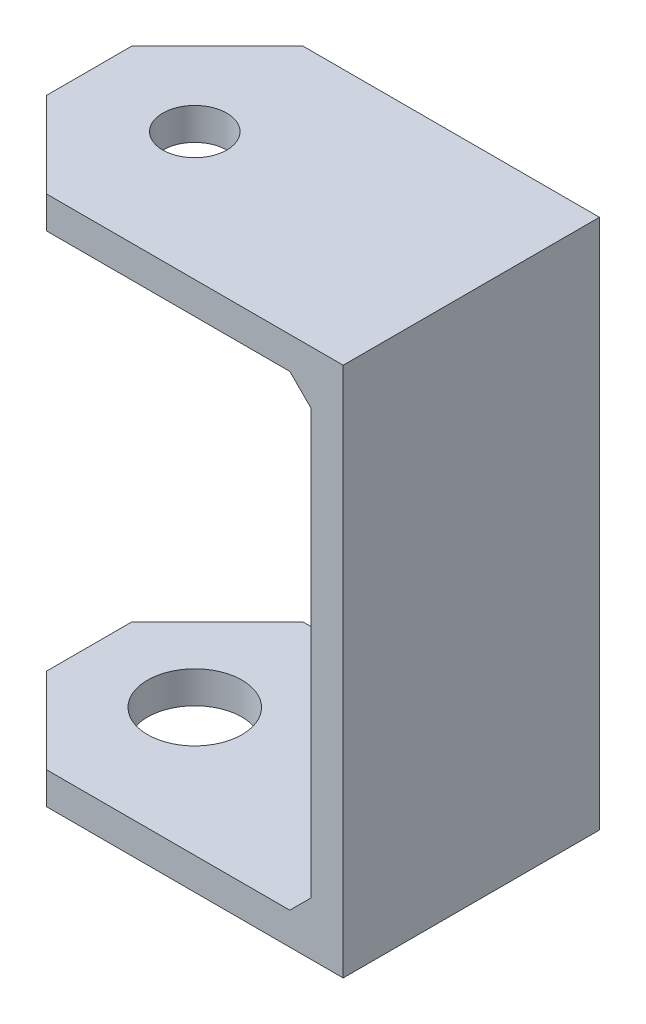
ISO-10303-21;
HEADER;
FILE_DESCRIPTION(('STEP AP214'),'2;1');
FILE_NAME('part.step','',(''),(''),'','','');
FILE_SCHEMA(('AUTOMOTIVE_DESIGN { 1 0 10303 214 1 1 1 1 }'));
ENDSEC;
DATA;
#1=APPLICATION_CONTEXT('core data for automotive mechanical design processes');
#2=APPLICATION_PROTOCOL_DEFINITION('international standard','automotive_design',2000,#1);
#3=PRODUCT_CONTEXT('',#1,'mechanical');
#4=PRODUCT('Part','Part','',(#3));
#5=PRODUCT_RELATED_PRODUCT_CATEGORY('part','',(#4));
#6=PRODUCT_DEFINITION_FORMATION('','',#4);
#7=PRODUCT_DEFINITION_CONTEXT('part definition',#1,'design');
#8=PRODUCT_DEFINITION('design','',#6,#7);
#9=PRODUCT_DEFINITION_SHAPE('','',#8);
#10=(LENGTH_UNIT() NAMED_UNIT(*) SI_UNIT(.MILLI.,.METRE.));
#11=(NAMED_UNIT(*) PLANE_ANGLE_UNIT() SI_UNIT($,.RADIAN.));
#12=(NAMED_UNIT(*) SI_UNIT($,.STERADIAN.) SOLID_ANGLE_UNIT());
#13=UNCERTAINTY_MEASURE_WITH_UNIT(LENGTH_MEASURE(1.E-05),#10,'distance_accuracy_value','');
#14=(GEOMETRIC_REPRESENTATION_CONTEXT(3) GLOBAL_UNCERTAINTY_ASSIGNED_CONTEXT((#13)) GLOBAL_UNIT_ASSIGNED_CONTEXT((#10,
#11,#12)) REPRESENTATION_CONTEXT('',''));
#15=CARTESIAN_POINT('',(0.,0.,0.));
#16=DIRECTION('',(0.,0.,1.));
#17=DIRECTION('',(1.,0.,0.));
#18=AXIS2_PLACEMENT_3D('',#15,#16,#17);
#19=CARTESIAN_POINT('',(0.,0.,-12.));
#20=DIRECTION('',(0.,0.,-1.));
#21=DIRECTION('',(-1.,0.,0.));
#22=AXIS2_PLACEMENT_3D('',#19,#20,#21);
#23=PLANE('',#22);
#24=DIRECTION('',(0.,1.,0.));
#25=VECTOR('',#24,1.);
#26=CARTESIAN_POINT('',(113.025,0.,-12.));
#27=LINE('',#26,#25);
#28=CARTESIAN_POINT('',(113.025,23.2021970213776,-12.));
#29=VERTEX_POINT('',#28);
#30=CARTESIAN_POINT('',(113.025,-26.4978029786224,-12.));
#31=VERTEX_POINT('',#30);
#32=EDGE_CURVE('E683',#29,#31,#27,.F.);
#33=ORIENTED_EDGE('',*,*,#32,.T.);
#34=DIRECTION('',(-1.,0.,0.));
#35=VECTOR('',#34,1.);
#36=CARTESIAN_POINT('',(0.,-26.4978029786224,-12.));
#37=LINE('',#36,#35);
#38=CARTESIAN_POINT('',(85.245,-26.4978029786222,-12.));
#39=VERTEX_POINT('',#38);
#40=EDGE_CURVE('E697',#31,#39,#37,.T.);
#41=ORIENTED_EDGE('',*,*,#40,.T.);
#42=DIRECTION('',(0.,1.,0.));
#43=VECTOR('',#42,1.);
#44=CARTESIAN_POINT('',(85.245,0.,-12.));
#45=LINE('',#44,#43);
#46=CARTESIAN_POINT('',(85.245,-23.4978029786221,-12.));
#47=VERTEX_POINT('',#46);
#48=EDGE_CURVE('E695',#39,#47,#45,.T.);
#49=ORIENTED_EDGE('',*,*,#48,.T.);
#50=DIRECTION('',(-1.,0.,0.));
#51=VECTOR('',#50,1.);
#52=CARTESIAN_POINT('',(0.,-23.4978029786221,-12.));
#53=LINE('',#52,#51);
#54=CARTESIAN_POINT('',(108.025,-23.4978029786223,-12.));
#55=VERTEX_POINT('',#54);
#56=EDGE_CURVE('E693',#47,#55,#53,.F.);
#57=ORIENTED_EDGE('',*,*,#56,.T.);
#58=DIRECTION('',(0.707106781186552,0.707106781186543,0.));
#59=VECTOR('',#58,1.);
#60=CARTESIAN_POINT('',(108.025,-23.4978029786224,-12.));
#61=LINE('',#60,#59);
#62=CARTESIAN_POINT('',(110.025,-21.4978029786224,-12.));
#63=VERTEX_POINT('',#62);
#64=EDGE_CURVE('E664',#55,#63,#61,.T.);
#65=ORIENTED_EDGE('',*,*,#64,.T.);
#66=DIRECTION('',(0.,1.,0.));
#67=VECTOR('',#66,1.);
#68=CARTESIAN_POINT('',(110.025,-23.4978029786224,-12.));
#69=LINE('',#68,#67);
#70=CARTESIAN_POINT('',(110.025,18.2021970213776,-12.));
#71=VERTEX_POINT('',#70);
#72=EDGE_CURVE('E45',#63,#71,#69,.T.);
#73=ORIENTED_EDGE('',*,*,#72,.T.);
#74=DIRECTION('',(0.707106781186545,-0.70710678118655,0.));
#75=VECTOR('',#74,1.);
#76=CARTESIAN_POINT('',(110.025,18.2021970213776,-12.));
#77=LINE('',#76,#75);
#78=CARTESIAN_POINT('',(108.025,20.2021970213776,-12.));
#79=VERTEX_POINT('',#78);
#80=EDGE_CURVE('E650',#79,#71,#77,.T.);
#81=ORIENTED_EDGE('',*,*,#80,.F.);
#82=DIRECTION('',(-1.,0.,0.));
#83=VECTOR('',#82,1.);
#84=CARTESIAN_POINT('',(0.,20.2021970213776,-12.));
#85=LINE('',#84,#83);
#86=CARTESIAN_POINT('',(85.245,20.2021970213778,-12.));
#87=VERTEX_POINT('',#86);
#88=EDGE_CURVE('E690',#79,#87,#85,.T.);
#89=ORIENTED_EDGE('',*,*,#88,.T.);
#90=DIRECTION('',(0.,1.,0.));
#91=VECTOR('',#90,1.);
#92=CARTESIAN_POINT('',(85.245,0.,-12.));
#93=LINE('',#92,#91);
#94=CARTESIAN_POINT('',(85.245,23.2021970213776,-12.));
#95=VERTEX_POINT('',#94);
#96=EDGE_CURVE('E688',#87,#95,#93,.T.);
#97=ORIENTED_EDGE('',*,*,#96,.T.);
#98=DIRECTION('',(-1.,0.,0.));
#99=VECTOR('',#98,1.);
#100=CARTESIAN_POINT('',(0.,23.2021970213776,-12.));
#101=LINE('',#100,#99);
#102=EDGE_CURVE('E685',#95,#29,#101,.F.);
#103=ORIENTED_EDGE('',*,*,#102,.T.);
#104=EDGE_LOOP('',(#33,#41,#49,#57,#65,#73,#81,#89,#97,#103));
#105=FACE_BOUND('',#104,.T.);
#106=ADVANCED_FACE('F35',(#105),#23,.T.);
#107=CARTESIAN_POINT('',(0.,0.,12.));
#108=DIRECTION('',(0.,0.,-1.));
#109=DIRECTION('',(-1.,0.,0.));
#110=AXIS2_PLACEMENT_3D('',#107,#108,#109);
#111=PLANE('',#110);
#112=DIRECTION('',(-0.707106781186545,0.70710678118655,0.));
#113=VECTOR('',#112,1.);
#114=CARTESIAN_POINT('',(110.025,18.2021970213776,12.));
#115=LINE('',#114,#113);
#116=CARTESIAN_POINT('',(110.025,18.2021970213776,12.));
#117=VERTEX_POINT('',#116);
#118=CARTESIAN_POINT('',(108.025,20.2021970213776,12.));
#119=VERTEX_POINT('',#118);
#120=EDGE_CURVE('E679',#117,#119,#115,.T.);
#121=ORIENTED_EDGE('',*,*,#120,.F.);
#122=DIRECTION('',(0.,1.,0.));
#123=VECTOR('',#122,1.);
#124=CARTESIAN_POINT('',(110.025,-23.4978029786224,12.));
#125=LINE('',#124,#123);
#126=CARTESIAN_POINT('',(110.025,-21.4978029786224,12.));
#127=VERTEX_POINT('',#126);
#128=EDGE_CURVE('E54',#117,#127,#125,.F.);
#129=ORIENTED_EDGE('',*,*,#128,.T.);
#130=DIRECTION('',(-0.707106781186552,-0.707106781186543,0.));
#131=VECTOR('',#130,1.);
#132=CARTESIAN_POINT('',(108.025,-23.4978029786224,12.));
#133=LINE('',#132,#131);
#134=CARTESIAN_POINT('',(108.025,-23.4978029786223,12.));
#135=VERTEX_POINT('',#134);
#136=EDGE_CURVE('E666',#135,#127,#133,.F.);
#137=ORIENTED_EDGE('',*,*,#136,.F.);
#138=DIRECTION('',(-1.,0.,0.));
#139=VECTOR('',#138,1.);
#140=CARTESIAN_POINT('',(0.,-23.4978029786221,12.));
#141=LINE('',#140,#139);
#142=CARTESIAN_POINT('',(85.245,-23.4978029786221,12.));
#143=VERTEX_POINT('',#142);
#144=EDGE_CURVE('E702',#143,#135,#141,.F.);
#145=ORIENTED_EDGE('',*,*,#144,.F.);
#146=DIRECTION('',(0.,1.,0.));
#147=VECTOR('',#146,1.);
#148=CARTESIAN_POINT('',(85.245,0.,12.));
#149=LINE('',#148,#147);
#150=CARTESIAN_POINT('',(85.245,-26.4978029786222,12.));
#151=VERTEX_POINT('',#150);
#152=EDGE_CURVE('E346',#151,#143,#149,.T.);
#153=ORIENTED_EDGE('',*,*,#152,.F.);
#154=DIRECTION('',(-1.,0.,0.));
#155=VECTOR('',#154,1.);
#156=CARTESIAN_POINT('',(0.,-26.4978029786224,12.));
#157=LINE('',#156,#155);
#158=CARTESIAN_POINT('',(113.025,-26.4978029786224,12.));
#159=VERTEX_POINT('',#158);
#160=EDGE_CURVE('E705',#159,#151,#157,.T.);
#161=ORIENTED_EDGE('',*,*,#160,.F.);
#162=DIRECTION('',(0.,1.,0.));
#163=VECTOR('',#162,1.);
#164=CARTESIAN_POINT('',(113.025,0.,12.));
#165=LINE('',#164,#163);
#166=CARTESIAN_POINT('',(113.025,23.2021970213776,12.));
#167=VERTEX_POINT('',#166);
#168=EDGE_CURVE('E655',#167,#159,#165,.F.);
#169=ORIENTED_EDGE('',*,*,#168,.F.);
#170=DIRECTION('',(-1.,0.,0.));
#171=VECTOR('',#170,1.);
#172=CARTESIAN_POINT('',(0.,23.2021970213776,12.));
#173=LINE('',#172,#171);
#174=CARTESIAN_POINT('',(85.245,23.2021970213776,12.));
#175=VERTEX_POINT('',#174);
#176=EDGE_CURVE('E668',#175,#167,#173,.F.);
#177=ORIENTED_EDGE('',*,*,#176,.F.);
#178=DIRECTION('',(0.,1.,0.));
#179=VECTOR('',#178,1.);
#180=CARTESIAN_POINT('',(85.245,0.,12.));
#181=LINE('',#180,#179);
#182=CARTESIAN_POINT('',(85.245,20.2021970213778,12.));
#183=VERTEX_POINT('',#182);
#184=EDGE_CURVE('E673',#183,#175,#181,.T.);
#185=ORIENTED_EDGE('',*,*,#184,.F.);
#186=DIRECTION('',(-1.,0.,0.));
#187=VECTOR('',#186,1.);
#188=CARTESIAN_POINT('',(0.,20.2021970213776,12.));
#189=LINE('',#188,#187);
#190=EDGE_CURVE('E676',#119,#183,#189,.T.);
#191=ORIENTED_EDGE('',*,*,#190,.F.);
#192=EDGE_LOOP('',(#121,#129,#137,#145,#153,#161,#169,#177,#185,#191));
#193=FACE_BOUND('',#192,.T.);
#194=ADVANCED_FACE('F389',(#193),#111,.F.);
#195=CARTESIAN_POINT('',(102.745792465031,-29.4978029786213,0.));
#196=DIRECTION('',(0.,1.,0.));
#197=DIRECTION('',(-1.,0.,0.));
#198=AXIS2_PLACEMENT_3D('',#195,#196,#197);
#199=PLANE('',#198);
#200=DIRECTION('',(-0.987918938593165,0.,-0.154971515992306));
#201=VECTOR('',#200,1.);
#202=CARTESIAN_POINT('',(91.55,-29.4978029786213,-4.77499999999995));
#203=LINE('',#202,#201);
#204=CARTESIAN_POINT('',(104.777797279098,-29.4978029786213,-2.7));
#205=VERTEX_POINT('',#204);
#206=CARTESIAN_POINT('',(91.55,-29.4978029786213,-4.77499999999996));
#207=VERTEX_POINT('',#206);
#208=EDGE_CURVE('E188',#205,#207,#203,.T.);
#209=ORIENTED_EDGE('',*,*,#208,.T.);
#210=DIRECTION('',(0.,0.,1.));
#211=VECTOR('',#210,1.);
#212=CARTESIAN_POINT('',(91.55,-29.4978029786213,-7.77499999999995));
#213=LINE('',#212,#211);
#214=CARTESIAN_POINT('',(91.55,-29.4978029786213,-7.77499999999996));
#215=VERTEX_POINT('',#214);
#216=EDGE_CURVE('E260',#207,#215,#213,.F.);
#217=ORIENTED_EDGE('',*,*,#216,.T.);
#218=DIRECTION('',(0.987918938593166,0.,0.154971515992304));
#219=VECTOR('',#218,1.);
#220=CARTESIAN_POINT('',(109.125000000004,-29.4978029786213,-5.01806895316332));
#221=LINE('',#220,#219);
#222=CARTESIAN_POINT('',(109.125000000004,-29.4978029786213,-5.01806895316332));
#223=VERTEX_POINT('',#222);
#224=EDGE_CURVE('E249',#215,#223,#221,.T.);
#225=ORIENTED_EDGE('',*,*,#224,.T.);
#226=DIRECTION('',(0.,0.,1.));
#227=VECTOR('',#226,1.);
#228=CARTESIAN_POINT('',(109.125000000004,-29.4978029786213,5.01806895316333));
#229=LINE('',#228,#227);
#230=CARTESIAN_POINT('',(109.125000000004,-29.4978029786213,5.01806895316333));
#231=VERTEX_POINT('',#230);
#232=EDGE_CURVE('E238',#223,#231,#229,.T.);
#233=ORIENTED_EDGE('',*,*,#232,.T.);
#234=DIRECTION('',(-0.987918938593166,0.,0.154971515992304));
#235=VECTOR('',#234,1.);
#236=CARTESIAN_POINT('',(91.5499999999997,-29.4978029786213,7.775));
#237=LINE('',#236,#235);
#238=CARTESIAN_POINT('',(91.5499999999997,-29.4978029786213,7.775));
#239=VERTEX_POINT('',#238);
#240=EDGE_CURVE('E227',#231,#239,#237,.T.);
#241=ORIENTED_EDGE('',*,*,#240,.T.);
#242=DIRECTION('',(0.,0.,1.));
#243=VECTOR('',#242,1.);
#244=CARTESIAN_POINT('',(91.5499999999997,-29.4978029786213,4.77499999999999));
#245=LINE('',#244,#243);
#246=CARTESIAN_POINT('',(91.5499999999997,-29.4978029786213,4.77499999999999));
#247=VERTEX_POINT('',#246);
#248=EDGE_CURVE('E214',#239,#247,#245,.F.);
#249=ORIENTED_EDGE('',*,*,#248,.T.);
#250=DIRECTION('',(0.987918938593165,0.,-0.154971515992306));
#251=VECTOR('',#250,1.);
#252=CARTESIAN_POINT('',(91.5499999999997,-29.4978029786213,4.77499999999999));
#253=LINE('',#252,#251);
#254=CARTESIAN_POINT('',(104.777797279098,-29.4978029786213,2.7));
#255=VERTEX_POINT('',#254);
#256=EDGE_CURVE('E182',#247,#255,#253,.T.);
#257=ORIENTED_EDGE('',*,*,#256,.T.);
#258=CARTESIAN_POINT('',(102.745792465031,-29.4978029786213,0.));
#259=DIRECTION('',(0.,1.,0.));
#260=DIRECTION('',(-1.,0.,0.));
#261=AXIS2_PLACEMENT_3D('',#258,#259,#260);
#262=CIRCLE('',#261,3.37920753496934);
#263=EDGE_CURVE('E39',#255,#205,#262,.T.);
#264=ORIENTED_EDGE('',*,*,#263,.T.);
#265=EDGE_LOOP('',(#209,#217,#225,#233,#241,#249,#257,#264));
#266=FACE_BOUND('',#265,.T.);
#267=ADVANCED_FACE('F37',(#266),#199,.F.);
#268=CARTESIAN_POINT('',(91.55,-29.4978029786213,-4.77499999999995));
#269=DIRECTION('',(0.154971515992306,0.,-0.987918938593165));
#270=DIRECTION('',(-0.987918938593165,0.,-0.154971515992306));
#271=AXIS2_PLACEMENT_3D('',#268,#269,#270);
#272=PLANE('',#271);
#273=DIRECTION('',(0.,1.,0.));
#274=VECTOR('',#273,1.);
#275=CARTESIAN_POINT('',(91.55,-29.4978029786213,-4.77499999999996));
#276=LINE('',#275,#274);
#277=CARTESIAN_POINT('',(91.55,-26.4978029786222,-4.77499999999996));
#278=VERTEX_POINT('',#277);
#279=EDGE_CURVE('E194',#278,#207,#276,.F.);
#280=ORIENTED_EDGE('',*,*,#279,.T.);
#281=ORIENTED_EDGE('',*,*,#208,.F.);
#282=DIRECTION('',(0.,1.,0.));
#283=VECTOR('',#282,1.);
#284=CARTESIAN_POINT('',(104.777797279098,-29.4978029786213,-2.7));
#285=LINE('',#284,#283);
#286=CARTESIAN_POINT('',(104.777797279098,-26.4978029786223,-2.7));
#287=VERTEX_POINT('',#286);
#288=EDGE_CURVE('E192',#205,#287,#285,.T.);
#289=ORIENTED_EDGE('',*,*,#288,.T.);
#290=DIRECTION('',(-0.987918938593165,0.,-0.154971515992306));
#291=VECTOR('',#290,1.);
#292=CARTESIAN_POINT('',(104.777797279098,-26.4978029786223,-2.7));
#293=LINE('',#292,#291);
#294=EDGE_CURVE('E265',#287,#278,#293,.T.);
#295=ORIENTED_EDGE('',*,*,#294,.T.);
#296=EDGE_LOOP('',(#280,#281,#289,#295));
#297=FACE_BOUND('',#296,.T.);
#298=ADVANCED_FACE('F190',(#297),#272,.F.);
#299=CARTESIAN_POINT('',(91.55,-29.4978029786213,-7.77499999999995));
#300=DIRECTION('',(1.,0.,0.));
#301=DIRECTION('',(0.,1.,0.));
#302=AXIS2_PLACEMENT_3D('',#299,#300,#301);
#303=PLANE('',#302);
#304=DIRECTION('',(0.,1.,0.));
#305=VECTOR('',#304,1.);
#306=CARTESIAN_POINT('',(91.5499999999999,-29.4978029786213,-7.77499999999995));
#307=LINE('',#306,#305);
#308=CARTESIAN_POINT('',(91.55,-26.4978029786222,-7.77499999999995));
#309=VERTEX_POINT('',#308);
#310=EDGE_CURVE('E257',#309,#215,#307,.F.);
#311=ORIENTED_EDGE('',*,*,#310,.T.);
#312=ORIENTED_EDGE('',*,*,#216,.F.);
#313=ORIENTED_EDGE('',*,*,#279,.F.);
#314=DIRECTION('',(0.,0.,1.));
#315=VECTOR('',#314,1.);
#316=CARTESIAN_POINT('',(91.55,-26.4978029786222,12.));
#317=LINE('',#316,#315);
#318=EDGE_CURVE('E254',#278,#309,#317,.F.);
#319=ORIENTED_EDGE('',*,*,#318,.T.);
#320=EDGE_LOOP('',(#311,#312,#313,#319));
#321=FACE_BOUND('',#320,.T.);
#322=ADVANCED_FACE('F379',(#321),#303,.F.);
#323=CARTESIAN_POINT('',(109.125000000004,-29.4978029786213,-5.01806895316332));
#324=DIRECTION('',(-0.154971515992304,0.,0.987918938593166));
#325=DIRECTION('',(0.987918938593166,0.,0.154971515992304));
#326=AXIS2_PLACEMENT_3D('',#323,#324,#325);
#327=PLANE('',#326);
#328=DIRECTION('',(0.,-1.,0.));
#329=VECTOR('',#328,1.);
#330=CARTESIAN_POINT('',(109.125000000004,-29.4978029786213,-5.01806895316332));
#331=LINE('',#330,#329);
#332=CARTESIAN_POINT('',(109.125000000004,-26.4978029786224,-5.01806895316332));
#333=VERTEX_POINT('',#332);
#334=EDGE_CURVE('E246',#333,#223,#331,.T.);
#335=ORIENTED_EDGE('',*,*,#334,.T.);
#336=ORIENTED_EDGE('',*,*,#224,.F.);
#337=ORIENTED_EDGE('',*,*,#310,.F.);
#338=DIRECTION('',(0.987918938593166,0.,0.154971515992304));
#339=VECTOR('',#338,1.);
#340=CARTESIAN_POINT('',(91.55,-26.4978029786222,-7.77499999999995));
#341=LINE('',#340,#339);
#342=EDGE_CURVE('E243',#309,#333,#341,.T.);
#343=ORIENTED_EDGE('',*,*,#342,.T.);
#344=EDGE_LOOP('',(#335,#336,#337,#343));
#345=FACE_BOUND('',#344,.T.);
#346=ADVANCED_FACE('F376',(#345),#327,.F.);
#347=CARTESIAN_POINT('',(109.125000000004,-29.4978029786213,5.01806895316333));
#348=DIRECTION('',(-1.,0.,0.));
#349=DIRECTION('',(0.,-1.,0.));
#350=AXIS2_PLACEMENT_3D('',#347,#348,#349);
#351=PLANE('',#350);
#352=DIRECTION('',(0.,1.,0.));
#353=VECTOR('',#352,1.);
#354=CARTESIAN_POINT('',(109.125000000004,-29.4978029786213,5.01806895316333));
#355=LINE('',#354,#353);
#356=CARTESIAN_POINT('',(109.125000000004,-26.4978029786223,5.01806895316332));
#357=VERTEX_POINT('',#356);
#358=EDGE_CURVE('E235',#357,#231,#355,.F.);
#359=ORIENTED_EDGE('',*,*,#358,.T.);
#360=ORIENTED_EDGE('',*,*,#232,.F.);
#361=ORIENTED_EDGE('',*,*,#334,.F.);
#362=DIRECTION('',(0.,0.,1.));
#363=VECTOR('',#362,1.);
#364=CARTESIAN_POINT('',(109.125000000004,-26.4978029786224,12.));
#365=LINE('',#364,#363);
#366=EDGE_CURVE('E232',#333,#357,#365,.T.);
#367=ORIENTED_EDGE('',*,*,#366,.T.);
#368=EDGE_LOOP('',(#359,#360,#361,#367));
#369=FACE_BOUND('',#368,.T.);
#370=ADVANCED_FACE('F372',(#369),#351,.F.);
#371=CARTESIAN_POINT('',(91.5499999999997,-29.4978029786213,7.775));
#372=DIRECTION('',(-0.154971515992304,0.,-0.987918938593166));
#373=DIRECTION('',(-0.987918938593166,0.,0.154971515992304));
#374=AXIS2_PLACEMENT_3D('',#371,#372,#373);
#375=PLANE('',#374);
#376=DIRECTION('',(0.,1.,0.));
#377=VECTOR('',#376,1.);
#378=CARTESIAN_POINT('',(91.5499999999997,-29.4978029786213,7.775));
#379=LINE('',#378,#377);
#380=CARTESIAN_POINT('',(91.5499999999997,-26.4978029786222,7.775));
#381=VERTEX_POINT('',#380);
#382=EDGE_CURVE('E224',#381,#239,#379,.F.);
#383=ORIENTED_EDGE('',*,*,#382,.T.);
#384=ORIENTED_EDGE('',*,*,#240,.F.);
#385=ORIENTED_EDGE('',*,*,#358,.F.);
#386=DIRECTION('',(-0.987918938593166,0.,0.154971515992304));
#387=VECTOR('',#386,1.);
#388=CARTESIAN_POINT('',(109.125000000004,-26.4978029786224,5.01806895316332));
#389=LINE('',#388,#387);
#390=EDGE_CURVE('E221',#357,#381,#389,.T.);
#391=ORIENTED_EDGE('',*,*,#390,.T.);
#392=EDGE_LOOP('',(#383,#384,#385,#391));
#393=FACE_BOUND('',#392,.T.);
#394=ADVANCED_FACE('F368',(#393),#375,.F.);
#395=CARTESIAN_POINT('',(91.5499999999997,-29.4978029786213,4.77499999999999));
#396=DIRECTION('',(1.,0.,0.));
#397=DIRECTION('',(0.,1.,0.));
#398=AXIS2_PLACEMENT_3D('',#395,#396,#397);
#399=PLANE('',#398);
#400=DIRECTION('',(0.,1.,0.));
#401=VECTOR('',#400,1.);
#402=CARTESIAN_POINT('',(91.5499999999997,-29.4978029786213,4.77499999999999));
#403=LINE('',#402,#401);
#404=CARTESIAN_POINT('',(91.5499999999997,-26.4978029786222,4.77499999999999));
#405=VERTEX_POINT('',#404);
#406=EDGE_CURVE('E208',#405,#247,#403,.F.);
#407=ORIENTED_EDGE('',*,*,#406,.T.);
#408=ORIENTED_EDGE('',*,*,#248,.F.);
#409=ORIENTED_EDGE('',*,*,#382,.F.);
#410=DIRECTION('',(0.,0.,1.));
#411=VECTOR('',#410,1.);
#412=CARTESIAN_POINT('',(91.5499999999997,-26.4978029786222,12.));
#413=LINE('',#412,#411);
#414=EDGE_CURVE('E217',#381,#405,#413,.F.);
#415=ORIENTED_EDGE('',*,*,#414,.T.);
#416=EDGE_LOOP('',(#407,#408,#409,#415));
#417=FACE_BOUND('',#416,.T.);
#418=ADVANCED_FACE('F364',(#417),#399,.F.);
#419=CARTESIAN_POINT('',(91.5499999999997,-29.4978029786213,4.77499999999999));
#420=DIRECTION('',(0.154971515992306,0.,0.987918938593165));
#421=DIRECTION('',(0.987918938593165,0.,-0.154971515992306));
#422=AXIS2_PLACEMENT_3D('',#419,#420,#421);
#423=PLANE('',#422);
#424=DIRECTION('',(0.,1.,0.));
#425=VECTOR('',#424,1.);
#426=CARTESIAN_POINT('',(104.777797279098,-29.4978029786213,2.70000000000001));
#427=LINE('',#426,#425);
#428=CARTESIAN_POINT('',(104.777797279098,-26.4978029786223,2.7));
#429=VERTEX_POINT('',#428);
#430=EDGE_CURVE('E204',#429,#255,#427,.F.);
#431=ORIENTED_EDGE('',*,*,#430,.T.);
#432=ORIENTED_EDGE('',*,*,#256,.F.);
#433=ORIENTED_EDGE('',*,*,#406,.F.);
#434=DIRECTION('',(0.987918938593165,0.,-0.154971515992306));
#435=VECTOR('',#434,1.);
#436=CARTESIAN_POINT('',(91.5499999999997,-26.4978029786222,4.77499999999999));
#437=LINE('',#436,#435);
#438=EDGE_CURVE('E220',#405,#429,#437,.T.);
#439=ORIENTED_EDGE('',*,*,#438,.T.);
#440=EDGE_LOOP('',(#431,#432,#433,#439));
#441=FACE_BOUND('',#440,.T.);
#442=ADVANCED_FACE('F357',(#441),#423,.F.);
#443=CARTESIAN_POINT('',(102.745792465031,-29.4978029786213,0.));
#444=DIRECTION('',(0.,1.,0.));
#445=DIRECTION('',(-1.,0.,0.));
#446=AXIS2_PLACEMENT_3D('',#443,#444,#445);
#447=CYLINDRICAL_SURFACE('',#446,3.37920753496934);
#448=ORIENTED_EDGE('',*,*,#288,.F.);
#449=ORIENTED_EDGE('',*,*,#263,.F.);
#450=ORIENTED_EDGE('',*,*,#430,.F.);
#451=CARTESIAN_POINT('',(102.745792465031,-26.4978029786223,0.));
#452=DIRECTION('',(0.,1.,0.));
#453=DIRECTION('',(-1.,0.,0.));
#454=AXIS2_PLACEMENT_3D('',#451,#452,#453);
#455=CIRCLE('',#454,3.37920753496934);
#456=EDGE_CURVE('E201',#429,#287,#455,.T.);
#457=ORIENTED_EDGE('',*,*,#456,.T.);
#458=EDGE_LOOP('',(#448,#449,#450,#457));
#459=FACE_BOUND('',#458,.T.);
#460=ADVANCED_FACE('F198',(#459),#447,.F.);
#461=CARTESIAN_POINT('',(103.55,-26.4978029786224,0.));
#462=DIRECTION('',(0.,-1.,0.));
#463=DIRECTION('',(0.,0.,-1.));
#464=AXIS2_PLACEMENT_3D('',#461,#462,#463);
#465=CYLINDRICAL_SURFACE('',#464,0.749999999999987);
#466=CARTESIAN_POINT('',(103.55,-23.4978029786223,0.));
#467=DIRECTION('',(0.,-1.,0.));
#468=DIRECTION('',(0.,0.,-1.));
#469=AXIS2_PLACEMENT_3D('',#466,#467,#468);
#470=CIRCLE('',#469,0.749999999999987);
#471=CARTESIAN_POINT('',(103.55,-23.4978029786223,-0.749999999999971));
#472=VERTEX_POINT('',#471);
#473=EDGE_CURVE('E304',#472,#472,#470,.F.);
#474=ORIENTED_EDGE('',*,*,#473,.T.);
#475=EDGE_LOOP('',(#474));
#476=FACE_BOUND('',#475,.T.);
#477=CARTESIAN_POINT('',(103.55,-26.4978029786224,0.));
#478=DIRECTION('',(0.,-1.,0.));
#479=DIRECTION('',(0.,0.,-1.));
#480=AXIS2_PLACEMENT_3D('',#477,#478,#479);
#481=CIRCLE('',#480,0.749999999999987);
#482=CARTESIAN_POINT('',(103.55,-26.4978029786224,-0.749999999999971));
#483=VERTEX_POINT('',#482);
#484=EDGE_CURVE('E308',#483,#483,#481,.T.);
#485=ORIENTED_EDGE('',*,*,#484,.T.);
#486=EDGE_LOOP('',(#485));
#487=FACE_BOUND('',#486,.T.);
#488=ADVANCED_FACE('F450',(#476,#487),#465,.F.);
#489=CARTESIAN_POINT('',(87.1250000000071,23.2031970213776,5.65519853168439E-13));
#490=DIRECTION('',(0.,-1.,0.));
#491=DIRECTION('',(1.,0.,0.));
#492=AXIS2_PLACEMENT_3D('',#489,#490,#491);
#493=CYLINDRICAL_SURFACE('',#492,4.42499999999281);
#494=CARTESIAN_POINT('',(87.1250000000071,-26.4978029786213,5.65519853168439E-13));
#495=DIRECTION('',(0.,-1.,0.));
#496=DIRECTION('',(1.,0.,0.));
#497=AXIS2_PLACEMENT_3D('',#494,#495,#496);
#498=CIRCLE('',#497,4.42499999999281);
#499=CARTESIAN_POINT('',(91.5499999999999,-26.4978029786213,5.65519853168439E-13));
#500=VERTEX_POINT('',#499);
#501=EDGE_CURVE('E312',#500,#500,#498,.T.);
#502=ORIENTED_EDGE('',*,*,#501,.T.);
#503=EDGE_LOOP('',(#502));
#504=FACE_BOUND('',#503,.T.);
#505=CARTESIAN_POINT('',(87.1250000000071,-23.4978029786221,5.65519853168439E-13));
#506=DIRECTION('',(0.,-1.,0.));
#507=DIRECTION('',(1.,0.,0.));
#508=AXIS2_PLACEMENT_3D('',#505,#506,#507);
#509=CIRCLE('',#508,4.42499999999281);
#510=CARTESIAN_POINT('',(91.5499999999999,-23.4978029786221,5.65519853168439E-13));
#511=VERTEX_POINT('',#510);
#512=EDGE_CURVE('E300',#511,#511,#509,.F.);
#513=ORIENTED_EDGE('',*,*,#512,.T.);
#514=EDGE_LOOP('',(#513));
#515=FACE_BOUND('',#514,.T.);
#516=ADVANCED_FACE('F447',(#504,#515),#493,.F.);
#517=CARTESIAN_POINT('',(77.245,-26.4978029786221,12.));
#518=DIRECTION('',(1.,0.,0.));
#519=DIRECTION('',(0.,1.,0.));
#520=AXIS2_PLACEMENT_3D('',#517,#518,#519);
#521=PLANE('',#520);
#522=DIRECTION('',(0.,1.,0.));
#523=VECTOR('',#522,1.);
#524=CARTESIAN_POINT('',(77.2450000000001,-3.94337340559048E-13,3.99999999999993));
#525=LINE('',#524,#523);
#526=CARTESIAN_POINT('',(77.245,-26.4978029786221,3.99999999999999));
#527=VERTEX_POINT('',#526);
#528=CARTESIAN_POINT('',(77.245,-23.4978029786221,3.99999999999999));
#529=VERTEX_POINT('',#528);
#530=EDGE_CURVE('E202',#527,#529,#525,.T.);
#531=ORIENTED_EDGE('',*,*,#530,.T.);
#532=DIRECTION('',(0.,0.,1.));
#533=VECTOR('',#532,1.);
#534=CARTESIAN_POINT('',(77.245,-23.4978029786221,12.));
#535=LINE('',#534,#533);
#536=CARTESIAN_POINT('',(77.245,-23.4978029786221,-4.));
#537=VERTEX_POINT('',#536);
#538=EDGE_CURVE('E333',#529,#537,#535,.F.);
#539=ORIENTED_EDGE('',*,*,#538,.T.);
#540=DIRECTION('',(0.,1.,0.));
#541=VECTOR('',#540,1.);
#542=CARTESIAN_POINT('',(77.245,-26.4978029786221,-4.00000000000001));
#543=LINE('',#542,#541);
#544=CARTESIAN_POINT('',(77.245,-26.4978029786221,-4.00000000000001));
#545=VERTEX_POINT('',#544);
#546=EDGE_CURVE('E307',#545,#537,#543,.T.);
#547=ORIENTED_EDGE('',*,*,#546,.F.);
#548=DIRECTION('',(0.,0.,1.));
#549=VECTOR('',#548,1.);
#550=CARTESIAN_POINT('',(77.245,-26.4978029786221,12.));
#551=LINE('',#550,#549);
#552=EDGE_CURVE('E318',#545,#527,#551,.T.);
#553=ORIENTED_EDGE('',*,*,#552,.T.);
#554=EDGE_LOOP('',(#531,#539,#547,#553));
#555=FACE_BOUND('',#554,.T.);
#556=ADVANCED_FACE('F331',(#555),#521,.F.);
#557=CARTESIAN_POINT('',(87.1250000000064,-26.4988029786224,1.45716771982052E-13));
#558=DIRECTION('',(0.,1.,0.));
#559=DIRECTION('',(0.,0.,1.));
#560=AXIS2_PLACEMENT_3D('',#557,#558,#559);
#561=CYLINDRICAL_SURFACE('',#560,2.99999999999388);
#562=CARTESIAN_POINT('',(87.1250000000064,20.2021970213778,1.45716771982052E-13));
#563=DIRECTION('',(0.,1.,0.));
#564=DIRECTION('',(0.,0.,1.));
#565=AXIS2_PLACEMENT_3D('',#562,#563,#564);
#566=CIRCLE('',#565,2.99999999999388);
#567=CARTESIAN_POINT('',(87.1250000000064,20.2021970213778,2.99999999999402));
#568=VERTEX_POINT('',#567);
#569=EDGE_CURVE('E295',#568,#568,#566,.F.);
#570=ORIENTED_EDGE('',*,*,#569,.T.);
#571=EDGE_LOOP('',(#570));
#572=FACE_BOUND('',#571,.T.);
#573=CARTESIAN_POINT('',(87.1250000000064,23.2021970213776,1.45716771982052E-13));
#574=DIRECTION('',(0.,1.,0.));
#575=DIRECTION('',(0.,0.,1.));
#576=AXIS2_PLACEMENT_3D('',#573,#574,#575);
#577=CIRCLE('',#576,2.99999999999388);
#578=CARTESIAN_POINT('',(87.1250000000064,23.2021970213776,2.99999999999402));
#579=VERTEX_POINT('',#578);
#580=EDGE_CURVE('E290',#579,#579,#577,.T.);
#581=ORIENTED_EDGE('',*,*,#580,.T.);
#582=EDGE_LOOP('',(#581));
#583=FACE_BOUND('',#582,.T.);
#584=ADVANCED_FACE('F440',(#572,#583),#561,.F.);
#585=CARTESIAN_POINT('',(77.245,20.2021970213779,12.));
#586=DIRECTION('',(1.,0.,0.));
#587=DIRECTION('',(0.,0.,-1.));
#588=AXIS2_PLACEMENT_3D('',#585,#586,#587);
#589=PLANE('',#588);
#590=DIRECTION('',(0.,1.,0.));
#591=VECTOR('',#590,1.);
#592=CARTESIAN_POINT('',(77.245,20.2021970213779,-4.00000000000001));
#593=LINE('',#592,#591);
#594=CARTESIAN_POINT('',(77.245,20.2021970213779,-4.00000000000001));
#595=VERTEX_POINT('',#594);
#596=CARTESIAN_POINT('',(77.245,23.2021970213776,-4.00000000000001));
#597=VERTEX_POINT('',#596);
#598=EDGE_CURVE('E299',#595,#597,#593,.T.);
#599=ORIENTED_EDGE('',*,*,#598,.F.);
#600=DIRECTION('',(0.,0.,1.));
#601=VECTOR('',#600,1.);
#602=CARTESIAN_POINT('',(77.245,20.2021970213779,12.));
#603=LINE('',#602,#601);
#604=CARTESIAN_POINT('',(77.245,20.2021970213779,3.99999999999998));
#605=VERTEX_POINT('',#604);
#606=EDGE_CURVE('E723',#595,#605,#603,.T.);
#607=ORIENTED_EDGE('',*,*,#606,.T.);
#608=DIRECTION('',(0.,1.,0.));
#609=VECTOR('',#608,1.);
#610=CARTESIAN_POINT('',(77.245,0.,3.99999999999998));
#611=LINE('',#610,#609);
#612=CARTESIAN_POINT('',(77.245,23.2021970213776,3.99999999999998));
#613=VERTEX_POINT('',#612);
#614=EDGE_CURVE('E294',#605,#613,#611,.T.);
#615=ORIENTED_EDGE('',*,*,#614,.T.);
#616=DIRECTION('',(0.,0.,-1.));
#617=VECTOR('',#616,1.);
#618=CARTESIAN_POINT('',(77.245,23.2021970213776,12.));
#619=LINE('',#618,#617);
#620=EDGE_CURVE('E711',#613,#597,#619,.T.);
#621=ORIENTED_EDGE('',*,*,#620,.T.);
#622=EDGE_LOOP('',(#599,#607,#615,#621));
#623=FACE_BOUND('',#622,.T.);
#624=ADVANCED_FACE('F437',(#623),#589,.F.);
#625=CARTESIAN_POINT('',(85.2450000000001,-3.94337340559048E-13,12.));
#626=DIRECTION('',(0.707106781186549,0.,-0.707106781186546));
#627=DIRECTION('',(-0.707106781186546,0.,-0.707106781186549));
#628=AXIS2_PLACEMENT_3D('',#625,#626,#627);
#629=PLANE('',#628);
#630=ORIENTED_EDGE('',*,*,#530,.F.);
#631=DIRECTION('',(0.707106781186546,0.,0.707106781186549));
#632=VECTOR('',#631,1.);
#633=CARTESIAN_POINT('',(77.245,-26.4978029786221,3.99999999999999));
#634=LINE('',#633,#632);
#635=EDGE_CURVE('E314',#527,#151,#634,.T.);
#636=ORIENTED_EDGE('',*,*,#635,.T.);
#637=ORIENTED_EDGE('',*,*,#152,.T.);
#638=DIRECTION('',(-0.707106781186546,0.,-0.707106781186549));
#639=VECTOR('',#638,1.);
#640=CARTESIAN_POINT('',(85.245,-23.4978029786221,12.));
#641=LINE('',#640,#639);
#642=EDGE_CURVE('E339',#143,#529,#641,.T.);
#643=ORIENTED_EDGE('',*,*,#642,.T.);
#644=EDGE_LOOP('',(#630,#636,#637,#643));
#645=FACE_BOUND('',#644,.T.);
#646=ADVANCED_FACE('F345',(#645),#629,.F.);
#647=CARTESIAN_POINT('',(113.025,-26.4978029786224,12.));
#648=DIRECTION('',(0.,1.,0.));
#649=DIRECTION('',(-1.,0.,0.));
#650=AXIS2_PLACEMENT_3D('',#647,#648,#649);
#651=PLANE('',#650);
#652=ORIENTED_EDGE('',*,*,#484,.F.);
#653=EDGE_LOOP('',(#652));
#654=FACE_BOUND('',#653,.T.);
#655=ORIENTED_EDGE('',*,*,#438,.F.);
#656=ORIENTED_EDGE('',*,*,#414,.F.);
#657=ORIENTED_EDGE('',*,*,#390,.F.);
#658=ORIENTED_EDGE('',*,*,#366,.F.);
#659=ORIENTED_EDGE('',*,*,#342,.F.);
#660=ORIENTED_EDGE('',*,*,#318,.F.);
#661=ORIENTED_EDGE('',*,*,#294,.F.);
#662=ORIENTED_EDGE('',*,*,#456,.F.);
#663=EDGE_LOOP('',(#655,#656,#657,#658,#659,#660,#661,#662));
#664=FACE_BOUND('',#663,.T.);
#665=ORIENTED_EDGE('',*,*,#501,.F.);
#666=EDGE_LOOP('',(#665));
#667=FACE_BOUND('',#666,.T.);
#668=ORIENTED_EDGE('',*,*,#635,.F.);
#669=ORIENTED_EDGE('',*,*,#552,.F.);
#670=DIRECTION('',(-0.707106781186548,0.,0.707106781186547));
#671=VECTOR('',#670,1.);
#672=CARTESIAN_POINT('',(77.245,-26.4978029786221,-4.00000000000001));
#673=LINE('',#672,#671);
#674=EDGE_CURVE('E311',#39,#545,#673,.T.);
#675=ORIENTED_EDGE('',*,*,#674,.F.);
#676=ORIENTED_EDGE('',*,*,#40,.F.);
#677=DIRECTION('',(0.,0.,1.));
#678=VECTOR('',#677,1.);
#679=CARTESIAN_POINT('',(113.025,-26.4978029786224,12.));
#680=LINE('',#679,#678);
#681=EDGE_CURVE('E343',#31,#159,#680,.T.);
#682=ORIENTED_EDGE('',*,*,#681,.T.);
#683=ORIENTED_EDGE('',*,*,#160,.T.);
#684=EDGE_LOOP('',(#668,#669,#675,#676,#682,#683));
#685=FACE_BOUND('',#684,.T.);
#686=ADVANCED_FACE('F360',(#654,#664,#667,#685),#651,.F.);
#687=CARTESIAN_POINT('',(77.245,-26.4978029786221,-4.00000000000001));
#688=DIRECTION('',(-0.707106781186547,0.,-0.707106781186548));
#689=DIRECTION('',(-0.707106781186548,0.,0.707106781186547));
#690=AXIS2_PLACEMENT_3D('',#687,#688,#689);
#691=PLANE('',#690);
#692=ORIENTED_EDGE('',*,*,#674,.T.);
#693=ORIENTED_EDGE('',*,*,#546,.T.);
#694=DIRECTION('',(0.707106781186548,0.,-0.707106781186547));
#695=VECTOR('',#694,1.);
#696=CARTESIAN_POINT('',(77.245,-23.4978029786221,-4.00000000000001));
#697=LINE('',#696,#695);
#698=EDGE_CURVE('E303',#537,#47,#697,.T.);
#699=ORIENTED_EDGE('',*,*,#698,.T.);
#700=ORIENTED_EDGE('',*,*,#48,.F.);
#701=EDGE_LOOP('',(#692,#693,#699,#700));
#702=FACE_BOUND('',#701,.T.);
#703=ADVANCED_FACE('F428',(#702),#691,.T.);
#704=CARTESIAN_POINT('',(77.245,-23.4978029786221,12.));
#705=DIRECTION('',(0.,-1.,0.));
#706=DIRECTION('',(1.,0.,0.));
#707=AXIS2_PLACEMENT_3D('',#704,#705,#706);
#708=PLANE('',#707);
#709=ORIENTED_EDGE('',*,*,#642,.F.);
#710=ORIENTED_EDGE('',*,*,#144,.T.);
#711=DIRECTION('',(0.,0.,1.));
#712=VECTOR('',#711,1.);
#713=CARTESIAN_POINT('',(108.025,-23.4978029786224,12.));
#714=LINE('',#713,#712);
#715=EDGE_CURVE('E699',#55,#135,#714,.T.);
#716=ORIENTED_EDGE('',*,*,#715,.F.);
#717=ORIENTED_EDGE('',*,*,#56,.F.);
#718=ORIENTED_EDGE('',*,*,#698,.F.);
#719=ORIENTED_EDGE('',*,*,#538,.F.);
#720=EDGE_LOOP('',(#709,#710,#716,#717,#718,#719));
#721=FACE_BOUND('',#720,.T.);
#722=ORIENTED_EDGE('',*,*,#512,.F.);
#723=EDGE_LOOP('',(#722));
#724=FACE_BOUND('',#723,.T.);
#725=ORIENTED_EDGE('',*,*,#473,.F.);
#726=EDGE_LOOP('',(#725));
#727=FACE_BOUND('',#726,.T.);
#728=ADVANCED_FACE('F337',(#721,#724,#727),#708,.F.);
#729=CARTESIAN_POINT('',(77.245,20.2021970213779,-4.00000000000001));
#730=DIRECTION('',(-0.707106781186546,0.,-0.707106781186549));
#731=DIRECTION('',(-0.707106781186549,0.,0.707106781186546));
#732=AXIS2_PLACEMENT_3D('',#729,#730,#731);
#733=PLANE('',#732);
#734=DIRECTION('',(-0.707106781186549,0.,0.707106781186546));
#735=VECTOR('',#734,1.);
#736=CARTESIAN_POINT('',(85.245,20.2021970213779,-12.));
#737=LINE('',#736,#735);
#738=EDGE_CURVE('E298',#87,#595,#737,.T.);
#739=ORIENTED_EDGE('',*,*,#738,.T.);
#740=ORIENTED_EDGE('',*,*,#598,.T.);
#741=DIRECTION('',(0.707106781186549,0.,-0.707106781186546));
#742=VECTOR('',#741,1.);
#743=CARTESIAN_POINT('',(77.245,23.2021970213776,-4.00000000000001));
#744=LINE('',#743,#742);
#745=EDGE_CURVE('E708',#597,#95,#744,.T.);
#746=ORIENTED_EDGE('',*,*,#745,.T.);
#747=ORIENTED_EDGE('',*,*,#96,.F.);
#748=EDGE_LOOP('',(#739,#740,#746,#747));
#749=FACE_BOUND('',#748,.T.);
#750=ADVANCED_FACE('F421',(#749),#733,.T.);
#751=CARTESIAN_POINT('',(113.025,23.2021970213776,12.));
#752=DIRECTION('',(-1.,0.,0.));
#753=DIRECTION('',(0.,0.,1.));
#754=AXIS2_PLACEMENT_3D('',#751,#752,#753);
#755=PLANE('',#754);
#756=ORIENTED_EDGE('',*,*,#681,.F.);
#757=ORIENTED_EDGE('',*,*,#32,.F.);
#758=DIRECTION('',(0.,0.,-1.));
#759=VECTOR('',#758,1.);
#760=CARTESIAN_POINT('',(113.025,23.2021970213776,12.));
#761=LINE('',#760,#759);
#762=EDGE_CURVE('E293',#29,#167,#761,.F.);
#763=ORIENTED_EDGE('',*,*,#762,.T.);
#764=ORIENTED_EDGE('',*,*,#168,.T.);
#765=EDGE_LOOP('',(#756,#757,#763,#764));
#766=FACE_BOUND('',#765,.T.);
#767=ADVANCED_FACE('F417',(#766),#755,.F.);
#768=CARTESIAN_POINT('',(110.025,20.2021970213776,12.));
#769=DIRECTION('',(0.,1.,0.));
#770=DIRECTION('',(-1.,0.,0.));
#771=AXIS2_PLACEMENT_3D('',#768,#769,#770);
#772=PLANE('',#771);
#773=ORIENTED_EDGE('',*,*,#738,.F.);
#774=ORIENTED_EDGE('',*,*,#88,.F.);
#775=DIRECTION('',(0.,0.,1.));
#776=VECTOR('',#775,1.);
#777=CARTESIAN_POINT('',(108.025,20.2021970213776,12.));
#778=LINE('',#777,#776);
#779=EDGE_CURVE('E652',#119,#79,#778,.F.);
#780=ORIENTED_EDGE('',*,*,#779,.F.);
#781=ORIENTED_EDGE('',*,*,#190,.T.);
#782=DIRECTION('',(-0.707106781186546,0.,-0.707106781186549));
#783=VECTOR('',#782,1.);
#784=CARTESIAN_POINT('',(85.245,20.2021970213779,12.));
#785=LINE('',#784,#783);
#786=EDGE_CURVE('E720',#183,#605,#785,.T.);
#787=ORIENTED_EDGE('',*,*,#786,.T.);
#788=ORIENTED_EDGE('',*,*,#606,.F.);
#789=EDGE_LOOP('',(#773,#774,#780,#781,#787,#788));
#790=FACE_BOUND('',#789,.T.);
#791=ORIENTED_EDGE('',*,*,#569,.F.);
#792=EDGE_LOOP('',(#791));
#793=FACE_BOUND('',#792,.T.);
#794=ADVANCED_FACE('F413',(#790,#793),#772,.F.);
#795=CARTESIAN_POINT('',(85.245,0.,12.));
#796=DIRECTION('',(0.707106781186549,0.,-0.707106781186546));
#797=DIRECTION('',(-0.707106781186546,0.,-0.707106781186549));
#798=AXIS2_PLACEMENT_3D('',#795,#796,#797);
#799=PLANE('',#798);
#800=ORIENTED_EDGE('',*,*,#614,.F.);
#801=ORIENTED_EDGE('',*,*,#786,.F.);
#802=ORIENTED_EDGE('',*,*,#184,.T.);
#803=DIRECTION('',(-0.707106781186546,0.,-0.707106781186549));
#804=VECTOR('',#803,1.);
#805=CARTESIAN_POINT('',(85.245,23.2021970213776,12.));
#806=LINE('',#805,#804);
#807=EDGE_CURVE('E714',#175,#613,#806,.T.);
#808=ORIENTED_EDGE('',*,*,#807,.T.);
#809=EDGE_LOOP('',(#800,#801,#802,#808));
#810=FACE_BOUND('',#809,.T.);
#811=ADVANCED_FACE('F409',(#810),#799,.F.);
#812=CARTESIAN_POINT('',(77.245,23.2021970213776,12.));
#813=DIRECTION('',(0.,-1.,0.));
#814=DIRECTION('',(0.,0.,-1.));
#815=AXIS2_PLACEMENT_3D('',#812,#813,#814);
#816=PLANE('',#815);
#817=ORIENTED_EDGE('',*,*,#745,.F.);
#818=ORIENTED_EDGE('',*,*,#620,.F.);
#819=ORIENTED_EDGE('',*,*,#807,.F.);
#820=ORIENTED_EDGE('',*,*,#176,.T.);
#821=ORIENTED_EDGE('',*,*,#762,.F.);
#822=ORIENTED_EDGE('',*,*,#102,.F.);
#823=EDGE_LOOP('',(#817,#818,#819,#820,#821,#822));
#824=FACE_BOUND('',#823,.T.);
#825=ORIENTED_EDGE('',*,*,#580,.F.);
#826=EDGE_LOOP('',(#825));
#827=FACE_BOUND('',#826,.T.);
#828=ADVANCED_FACE('F405',(#824,#827),#816,.F.);
#829=CARTESIAN_POINT('',(108.025,-23.4978029786224,12.));
#830=DIRECTION('',(-0.707106781186543,0.707106781186552,0.));
#831=DIRECTION('',(-0.707106781186552,-0.707106781186543,0.));
#832=AXIS2_PLACEMENT_3D('',#829,#830,#831);
#833=PLANE('',#832);
#834=ORIENTED_EDGE('',*,*,#64,.F.);
#835=ORIENTED_EDGE('',*,*,#715,.T.);
#836=ORIENTED_EDGE('',*,*,#136,.T.);
#837=DIRECTION('',(0.,0.,-1.));
#838=VECTOR('',#837,1.);
#839=CARTESIAN_POINT('',(110.025,-21.4978029786224,12.));
#840=LINE('',#839,#838);
#841=EDGE_CURVE('E659',#127,#63,#840,.T.);
#842=ORIENTED_EDGE('',*,*,#841,.T.);
#843=EDGE_LOOP('',(#834,#835,#836,#842));
#844=FACE_BOUND('',#843,.T.);
#845=ADVANCED_FACE('F402',(#844),#833,.T.);
#846=CARTESIAN_POINT('',(110.025,18.2021970213776,12.));
#847=DIRECTION('',(-0.70710678118655,-0.707106781186545,0.));
#848=DIRECTION('',(0.707106781186545,-0.70710678118655,0.));
#849=AXIS2_PLACEMENT_3D('',#846,#847,#848);
#850=PLANE('',#849);
#851=ORIENTED_EDGE('',*,*,#80,.T.);
#852=DIRECTION('',(0.,0.,-1.));
#853=VECTOR('',#852,1.);
#854=CARTESIAN_POINT('',(110.025,18.2021970213776,12.));
#855=LINE('',#854,#853);
#856=EDGE_CURVE('E11',#71,#117,#855,.F.);
#857=ORIENTED_EDGE('',*,*,#856,.T.);
#858=ORIENTED_EDGE('',*,*,#120,.T.);
#859=ORIENTED_EDGE('',*,*,#779,.T.);
#860=EDGE_LOOP('',(#851,#857,#858,#859));
#861=FACE_BOUND('',#860,.T.);
#862=ADVANCED_FACE('F401',(#861),#850,.T.);
#863=CARTESIAN_POINT('',(110.025,-23.4978029786224,12.));
#864=DIRECTION('',(1.,0.,0.));
#865=DIRECTION('',(0.,0.,-1.));
#866=AXIS2_PLACEMENT_3D('',#863,#864,#865);
#867=PLANE('',#866);
#868=ORIENTED_EDGE('',*,*,#856,.F.);
#869=ORIENTED_EDGE('',*,*,#72,.F.);
#870=ORIENTED_EDGE('',*,*,#841,.F.);
#871=ORIENTED_EDGE('',*,*,#128,.F.);
#872=EDGE_LOOP('',(#868,#869,#870,#871));
#873=FACE_BOUND('',#872,.T.);
#874=ADVANCED_FACE('F398',(#873),#867,.F.);
#875=CLOSED_SHELL('',(#106,#194,#267,#298,#322,#346,#370,#394,#418,#442,#460,#488,#516,#556,
#584,#624,#646,#686,#703,#728,#750,#767,#794,#811,#828,#845,#862,#874));
#876=MANIFOLD_SOLID_BREP('B2',#875);
#877=ADVANCED_BREP_SHAPE_REPRESENTATION('',(#18,#876),#14);
#878=SHAPE_DEFINITION_REPRESENTATION(#9,#877);
ENDSEC;
END-ISO-10303-21;
